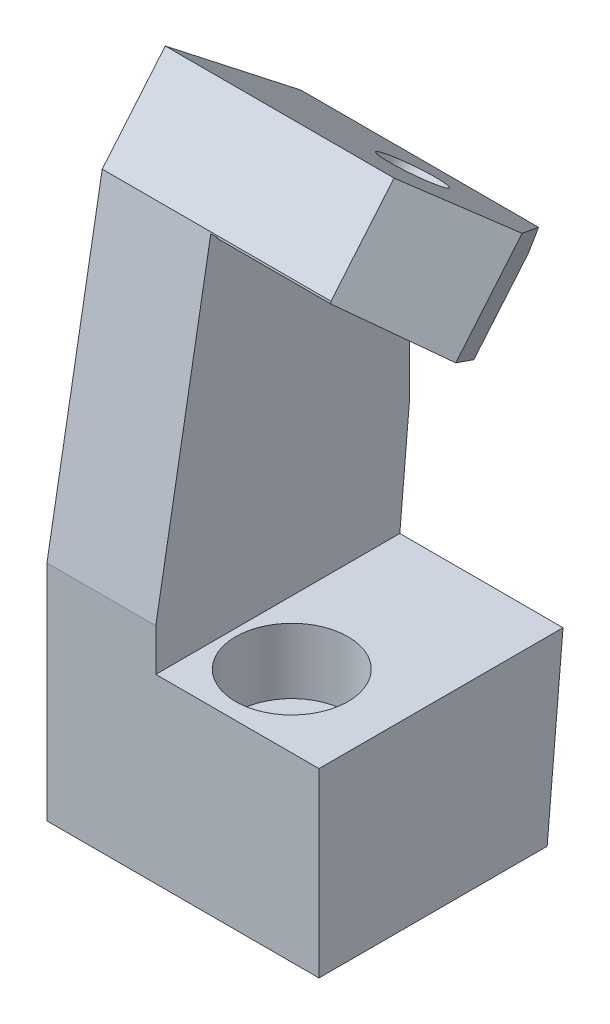
ISO-10303-21;
HEADER;
FILE_DESCRIPTION(('STEP AP214'),'2;1');
FILE_NAME('part.step','',(''),(''),'','','');
FILE_SCHEMA(('AUTOMOTIVE_DESIGN { 1 0 10303 214 1 1 1 1 }'));
ENDSEC;
DATA;
#1=APPLICATION_CONTEXT('core data for automotive mechanical design processes');
#2=APPLICATION_PROTOCOL_DEFINITION('international standard','automotive_design',2000,#1);
#3=PRODUCT_CONTEXT('',#1,'mechanical');
#4=PRODUCT('Part','Part','',(#3));
#5=PRODUCT_RELATED_PRODUCT_CATEGORY('part','',(#4));
#6=PRODUCT_DEFINITION_FORMATION('','',#4);
#7=PRODUCT_DEFINITION_CONTEXT('part definition',#1,'design');
#8=PRODUCT_DEFINITION('design','',#6,#7);
#9=PRODUCT_DEFINITION_SHAPE('','',#8);
#10=(LENGTH_UNIT() NAMED_UNIT(*) SI_UNIT(.MILLI.,.METRE.));
#11=(NAMED_UNIT(*) PLANE_ANGLE_UNIT() SI_UNIT($,.RADIAN.));
#12=(NAMED_UNIT(*) SI_UNIT($,.STERADIAN.) SOLID_ANGLE_UNIT());
#13=UNCERTAINTY_MEASURE_WITH_UNIT(LENGTH_MEASURE(1.E-05),#10,'distance_accuracy_value','');
#14=(GEOMETRIC_REPRESENTATION_CONTEXT(3) GLOBAL_UNCERTAINTY_ASSIGNED_CONTEXT((#13)) GLOBAL_UNIT_ASSIGNED_CONTEXT((#10,
#11,#12)) REPRESENTATION_CONTEXT('',''));
#15=CARTESIAN_POINT('',(0.,0.,0.));
#16=DIRECTION('',(0.,0.,1.));
#17=DIRECTION('',(1.,0.,0.));
#18=AXIS2_PLACEMENT_3D('',#15,#16,#17);
#19=CARTESIAN_POINT('',(5.5,41.9,1.));
#20=DIRECTION('',(0.,-1.,0.));
#21=DIRECTION('',(0.,0.,-1.));
#22=AXIS2_PLACEMENT_3D('',#19,#20,#21);
#23=PLANE('',#22);
#24=CARTESIAN_POINT('',(5.5,41.9,1.));
#25=DIRECTION('',(0.,-1.,0.));
#26=DIRECTION('',(0.,0.,-1.));
#27=AXIS2_PLACEMENT_3D('',#24,#25,#26);
#28=CIRCLE('',#27,1.6);
#29=CARTESIAN_POINT('',(5.5,41.9,-0.6));
#30=VERTEX_POINT('',#29);
#31=EDGE_CURVE('E232',#30,#30,#28,.T.);
#32=ORIENTED_EDGE('',*,*,#31,.T.);
#33=EDGE_LOOP('',(#32));
#34=FACE_BOUND('',#33,.T.);
#35=CARTESIAN_POINT('',(5.5,41.9,0.999999999999999));
#36=DIRECTION('',(0.,-1.,0.));
#37=DIRECTION('',(0.,0.,-1.));
#38=AXIS2_PLACEMENT_3D('',#35,#36,#37);
#39=CIRCLE('',#38,3.1);
#40=CARTESIAN_POINT('',(5.5,41.9,-2.1));
#41=VERTEX_POINT('',#40);
#42=EDGE_CURVE('E19',#41,#41,#39,.F.);
#43=ORIENTED_EDGE('',*,*,#42,.T.);
#44=EDGE_LOOP('',(#43));
#45=FACE_BOUND('',#44,.T.);
#46=ADVANCED_FACE('F16',(#34,#45),#23,.F.);
#47=CARTESIAN_POINT('',(8.6,65.,-4.8));
#48=DIRECTION('',(0.,0.76604444311876,-0.642787609686799));
#49=DIRECTION('',(0.,0.642787609686799,0.76604444311876));
#50=AXIS2_PLACEMENT_3D('',#47,#48,#49);
#51=PLANE('',#50);
#52=CARTESIAN_POINT('',(5.5,64.9977832745084,-4.8026417905683));
#53=DIRECTION('',(0.,-0.76604444311876,0.642787609686799));
#54=DIRECTION('',(0.,-0.642787609686799,-0.76604444311876));
#55=AXIS2_PLACEMENT_3D('',#52,#53,#54);
#56=CIRCLE('',#55,1.6);
#57=CARTESIAN_POINT('',(5.5,63.9693230990095,-6.02831289955832));
#58=VERTEX_POINT('',#57);
#59=EDGE_CURVE('E211',#58,#58,#56,.F.);
#60=ORIENTED_EDGE('',*,*,#59,.T.);
#61=EDGE_LOOP('',(#60));
#62=FACE_BOUND('',#61,.T.);
#63=DIRECTION('',(0.499999999999779,0.556670399226475,0.663413948169059));
#64=VECTOR('',#63,1.);
#65=CARTESIAN_POINT('',(2.40000000000056,64.9999999999998,-4.80000000000025));
#66=LINE('',#65,#64);
#67=CARTESIAN_POINT('',(2.40000000000014,64.9999999999999,-4.80000000000006));
#68=VERTEX_POINT('',#67);
#69=CARTESIAN_POINT('',(3.95,66.7256782376024,-2.74341676067633));
#70=VERTEX_POINT('',#69);
#71=EDGE_CURVE('E164',#68,#70,#66,.T.);
#72=ORIENTED_EDGE('',*,*,#71,.F.);
#73=DIRECTION('',(-0.499999999999779,0.556670399226474,0.663413948169059));
#74=VECTOR('',#73,1.);
#75=CARTESIAN_POINT('',(3.94999999999944,63.2743217623978,-6.85658323932425));
#76=LINE('',#75,#74);
#77=CARTESIAN_POINT('',(3.94999999999986,63.2743217623976,-6.85658323932373));
#78=VERTEX_POINT('',#77);
#79=EDGE_CURVE('E306',#78,#68,#76,.T.);
#80=ORIENTED_EDGE('',*,*,#79,.F.);
#81=DIRECTION('',(1.,0.,0.));
#82=VECTOR('',#81,1.);
#83=CARTESIAN_POINT('',(3.95,63.274321762398,-6.856583239324));
#84=LINE('',#83,#82);
#85=CARTESIAN_POINT('',(7.05,63.2743217623976,-6.85658323932367));
#86=VERTEX_POINT('',#85);
#87=EDGE_CURVE('E300',#86,#78,#84,.F.);
#88=ORIENTED_EDGE('',*,*,#87,.F.);
#89=DIRECTION('',(-0.499999999999779,-0.556670399226475,-0.663413948169059));
#90=VECTOR('',#89,1.);
#91=CARTESIAN_POINT('',(8.59999999999944,65.0000000000002,-4.79999999999975));
#92=LINE('',#91,#90);
#93=CARTESIAN_POINT('',(8.59999999999986,65.0000000000001,-4.79999999999994));
#94=VERTEX_POINT('',#93);
#95=EDGE_CURVE('E184',#94,#86,#92,.T.);
#96=ORIENTED_EDGE('',*,*,#95,.F.);
#97=DIRECTION('',(0.499999999999779,-0.556670399226475,-0.663413948169059));
#98=VECTOR('',#97,1.);
#99=CARTESIAN_POINT('',(7.05000000000056,66.7256782376022,-2.74341676067575));
#100=LINE('',#99,#98);
#101=CARTESIAN_POINT('',(7.05000000000014,66.7256782376025,-2.74341676067627));
#102=VERTEX_POINT('',#101);
#103=EDGE_CURVE('E179',#102,#94,#100,.T.);
#104=ORIENTED_EDGE('',*,*,#103,.F.);
#105=DIRECTION('',(1.,0.,0.));
#106=VECTOR('',#105,1.);
#107=CARTESIAN_POINT('',(7.05,66.725678237602,-2.743416760676));
#108=LINE('',#107,#106);
#109=EDGE_CURVE('E169',#70,#102,#108,.T.);
#110=ORIENTED_EDGE('',*,*,#109,.F.);
#111=EDGE_LOOP('',(#72,#80,#88,#96,#104,#110));
#112=FACE_BOUND('',#111,.T.);
#113=ADVANCED_FACE('F182',(#62,#112),#51,.F.);
#114=CARTESIAN_POINT('',(5.5,46.9,1.));
#115=DIRECTION('',(0.,-1.,0.));
#116=DIRECTION('',(0.,0.,-1.));
#117=AXIS2_PLACEMENT_3D('',#114,#115,#116);
#118=CYLINDRICAL_SURFACE('',#117,3.1);
#119=ORIENTED_EDGE('',*,*,#42,.F.);
#120=EDGE_LOOP('',(#119));
#121=FACE_BOUND('',#120,.T.);
#122=CARTESIAN_POINT('',(5.5,45.5,1.));
#123=DIRECTION('',(0.,-1.,0.));
#124=DIRECTION('',(0.,0.,-1.));
#125=AXIS2_PLACEMENT_3D('',#122,#123,#124);
#126=CIRCLE('',#125,3.1);
#127=CARTESIAN_POINT('',(5.5,45.5,-2.1));
#128=VERTEX_POINT('',#127);
#129=EDGE_CURVE('E224',#128,#128,#126,.T.);
#130=ORIENTED_EDGE('',*,*,#129,.F.);
#131=EDGE_LOOP('',(#130));
#132=FACE_BOUND('',#131,.T.);
#133=ADVANCED_FACE('F244',(#121,#132),#118,.F.);
#134=CARTESIAN_POINT('',(5.5,42.,1.));
#135=DIRECTION('',(0.,-1.,0.));
#136=DIRECTION('',(0.,0.,-1.));
#137=AXIS2_PLACEMENT_3D('',#134,#135,#136);
#138=CYLINDRICAL_SURFACE('',#137,1.6);
#139=CARTESIAN_POINT('',(5.5,35.5,0.999999999999999));
#140=DIRECTION('',(0.,-1.,0.));
#141=DIRECTION('',(0.,0.,-1.));
#142=AXIS2_PLACEMENT_3D('',#139,#140,#141);
#143=CIRCLE('',#142,1.6);
#144=CARTESIAN_POINT('',(5.5,35.5,-0.600000000000002));
#145=VERTEX_POINT('',#144);
#146=EDGE_CURVE('E218',#145,#145,#143,.T.);
#147=ORIENTED_EDGE('',*,*,#146,.T.);
#148=EDGE_LOOP('',(#147));
#149=FACE_BOUND('',#148,.T.);
#150=ORIENTED_EDGE('',*,*,#31,.F.);
#151=EDGE_LOOP('',(#150));
#152=FACE_BOUND('',#151,.T.);
#153=ADVANCED_FACE('F247',(#149,#152),#138,.F.);
#154=CARTESIAN_POINT('',(5.5,70.,-9.));
#155=DIRECTION('',(0.,-0.76604444311876,0.642787609686799));
#156=DIRECTION('',(0.,-0.642787609686799,-0.76604444311876));
#157=AXIS2_PLACEMENT_3D('',#154,#155,#156);
#158=CYLINDRICAL_SURFACE('',#157,1.6);
#159=ORIENTED_EDGE('',*,*,#59,.F.);
#160=EDGE_LOOP('',(#159));
#161=FACE_BOUND('',#160,.T.);
#162=CARTESIAN_POINT('',(5.5,66.015808099298,-5.65686604557917));
#163=DIRECTION('',(0.,-0.788010753606662,0.615661475325736));
#164=DIRECTION('',(0.,0.615661475325736,0.788010753606662));
#165=AXIS2_PLACEMENT_3D('',#162,#163,#164);
#166=ELLIPSE('',#165,1.60097527087813,1.6);
#167=CARTESIAN_POINT('',(5.5,67.0014668965269,-4.39528031586887));
#168=VERTEX_POINT('',#167);
#169=EDGE_CURVE('E212',#168,#168,#166,.F.);
#170=ORIENTED_EDGE('',*,*,#169,.T.);
#171=EDGE_LOOP('',(#170));
#172=FACE_BOUND('',#171,.T.);
#173=ADVANCED_FACE('F692',(#161,#172),#158,.F.);
#174=CARTESIAN_POINT('',(11.6,66.3,-5.8));
#175=DIRECTION('',(-0.866025403784566,-0.32139380484321,-0.38302222155925));
#176=DIRECTION('',(-0.404481746651745,0.,0.914546071352096));
#177=AXIS2_PLACEMENT_3D('',#174,#175,#176);
#178=PLANE('',#177);
#179=DIRECTION('',(-0.277350098111332,0.946172684056587,-0.166835772611237));
#180=VECTOR('',#179,1.);
#181=CARTESIAN_POINT('',(8.64822751121891,64.9900620807997,1.97321973987984));
#182=LINE('',#181,#180);
#183=CARTESIAN_POINT('',(8.64822751121796,64.9900620807997,1.97321973987963));
#184=VERTEX_POINT('',#183);
#185=CARTESIAN_POINT('',(8.61501166663479,65.1033770752301,1.95323924904375));
#186=VERTEX_POINT('',#185);
#187=EDGE_CURVE('E208',#184,#186,#182,.T.);
#188=ORIENTED_EDGE('',*,*,#187,.F.);
#189=DIRECTION('',(0.499999999999988,-0.556670399226648,-0.663413948168756));
#190=VECTOR('',#189,1.);
#191=CARTESIAN_POINT('',(8.648227511217,64.9900620808002,1.97321973987798));
#192=LINE('',#191,#190);
#193=CARTESIAN_POINT('',(11.5999999999999,61.7037333412863,-1.94327434188064));
#194=VERTEX_POINT('',#193);
#195=EDGE_CURVE('E345',#184,#194,#192,.T.);
#196=ORIENTED_EDGE('',*,*,#195,.T.);
#197=DIRECTION('',(1.0827264915471E-13,0.76604444311896,-0.642787609686561));
#198=VECTOR('',#197,1.);
#199=CARTESIAN_POINT('',(11.5999999999981,61.7037333412867,-1.94327434188016));
#200=LINE('',#199,#198);
#201=CARTESIAN_POINT('',(11.5999999999994,66.0607960692296,-5.59928406991396));
#202=VERTEX_POINT('',#201);
#203=EDGE_CURVE('E189',#194,#202,#200,.T.);
#204=ORIENTED_EDGE('',*,*,#203,.T.);
#205=DIRECTION('',(-0.499771507944661,0.533259671054525,0.682541253752137));
#206=VECTOR('',#205,1.);
#207=CARTESIAN_POINT('',(11.6,66.0607960692303,-5.59928406991501));
#208=LINE('',#207,#206);
#209=CARTESIAN_POINT('',(8.61501166663423,69.2457993586304,-1.52266576113909));
#210=VERTEX_POINT('',#209);
#211=EDGE_CURVE('E217',#202,#210,#208,.T.);
#212=ORIENTED_EDGE('',*,*,#211,.T.);
#213=DIRECTION('',(0.,0.76604444311876,-0.642787609686799));
#214=VECTOR('',#213,1.);
#215=CARTESIAN_POINT('',(8.615011666634,76.358185854702,-7.490666646785));
#216=LINE('',#215,#214);
#217=EDGE_CURVE('E348',#210,#186,#216,.F.);
#218=ORIENTED_EDGE('',*,*,#217,.T.);
#219=EDGE_LOOP('',(#188,#196,#204,#212,#218));
#220=FACE_BOUND('',#219,.T.);
#221=ADVANCED_FACE('F682',(#220),#178,.F.);
#222=CARTESIAN_POINT('',(8.55,62.904310564719,-9.846825083831));
#223=DIRECTION('',(-0.866025403784566,0.32139380484321,0.38302222155925));
#224=DIRECTION('',(0.404481746651745,0.,0.914546071352096));
#225=AXIS2_PLACEMENT_3D('',#222,#223,#224);
#226=PLANE('',#225);
#227=ORIENTED_EDGE('',*,*,#203,.F.);
#228=DIRECTION('',(-0.500000000000036,-0.556670399226631,-0.663413948168734));
#229=VECTOR('',#228,1.);
#230=CARTESIAN_POINT('',(11.6,61.703733341286,-1.943274341881));
#231=LINE('',#230,#229);
#232=CARTESIAN_POINT('',(8.54999999999983,58.308043906005,-5.99009942571038));
#233=VERTEX_POINT('',#232);
#234=EDGE_CURVE('E341',#194,#233,#231,.T.);
#235=ORIENTED_EDGE('',*,*,#234,.T.);
#236=DIRECTION('',(0.,-0.76604444311876,0.642787609686799));
#237=VECTOR('',#236,1.);
#238=CARTESIAN_POINT('',(8.55,62.904310564719,-9.846825083831));
#239=LINE('',#238,#237);
#240=CARTESIAN_POINT('',(8.55000000000001,61.895103728765,-8.99999999999998));
#241=VERTEX_POINT('',#240);
#242=EDGE_CURVE('E360',#233,#241,#239,.F.);
#243=ORIENTED_EDGE('',*,*,#242,.T.);
#244=DIRECTION('',(-0.34792702276705,-0.937521619392564,-1.39053062840272E-13));
#245=VECTOR('',#244,1.);
#246=CARTESIAN_POINT('',(9.1099220462825,63.4038655932202,-8.99999999999978));
#247=LINE('',#246,#245);
#248=CARTESIAN_POINT('',(9.10992204628275,63.4038655932204,-9.00000000000013));
#249=VERTEX_POINT('',#248);
#250=EDGE_CURVE('E205',#249,#241,#247,.T.);
#251=ORIENTED_EDGE('',*,*,#250,.F.);
#252=DIRECTION('',(0.499771507944679,0.533259671054519,0.682541253752128));
#253=VECTOR('',#252,1.);
#254=CARTESIAN_POINT('',(9.10992204628301,63.4038655932212,-9.00000000000095));
#255=LINE('',#254,#253);
#256=EDGE_CURVE('E356',#249,#202,#255,.T.);
#257=ORIENTED_EDGE('',*,*,#256,.T.);
#258=EDGE_LOOP('',(#227,#235,#243,#251,#257));
#259=FACE_BOUND('',#258,.T.);
#260=ADVANCED_FACE('F673',(#259),#226,.F.);
#261=CARTESIAN_POINT('',(8.6,65.,-4.8));
#262=DIRECTION('',(-0.866025403784566,-0.32139380484321,-0.38302222155925));
#263=DIRECTION('',(-0.404481746651745,0.,0.914546071352096));
#264=AXIS2_PLACEMENT_3D('',#261,#262,#263);
#265=PLANE('',#264);
#266=DIRECTION('',(-0.500000000000015,0.556670399226639,0.663413948168743));
#267=VECTOR('',#266,1.);
#268=CARTESIAN_POINT('',(8.6,61.659008533276,-1.99657529250498));
#269=LINE('',#268,#267);
#270=CARTESIAN_POINT('',(8.59999999999992,61.6590085332761,-1.99657529250485));
#271=VERTEX_POINT('',#270);
#272=CARTESIAN_POINT('',(7.0500000000005,63.3846867708786,0.0600079468188868));
#273=VERTEX_POINT('',#272);
#274=EDGE_CURVE('E193',#271,#273,#269,.T.);
#275=ORIENTED_EDGE('',*,*,#274,.T.);
#276=DIRECTION('',(0.,0.76604444311876,-0.642787609686799));
#277=VECTOR('',#276,1.);
#278=CARTESIAN_POINT('',(7.05,66.725678237602,-2.743416760676));
#279=LINE('',#278,#277);
#280=EDGE_CURVE('E174',#102,#273,#279,.F.);
#281=ORIENTED_EDGE('',*,*,#280,.F.);
#282=ORIENTED_EDGE('',*,*,#103,.T.);
#283=DIRECTION('',(0.,0.766044443118905,-0.642787609686626));
#284=VECTOR('',#283,1.);
#285=CARTESIAN_POINT('',(8.59999999999918,61.6590085332763,-1.99657529250464));
#286=LINE('',#285,#284);
#287=EDGE_CURVE('E290',#271,#94,#286,.T.);
#288=ORIENTED_EDGE('',*,*,#287,.F.);
#289=EDGE_LOOP('',(#275,#281,#282,#288));
#290=FACE_BOUND('',#289,.T.);
#291=ADVANCED_FACE('F192',(#290),#265,.T.);
#292=CARTESIAN_POINT('',(7.05,66.725678237602,-2.743416760676));
#293=DIRECTION('',(0.,-0.642787609686799,-0.76604444311876));
#294=DIRECTION('',(0.,0.76604444311876,-0.642787609686799));
#295=AXIS2_PLACEMENT_3D('',#292,#293,#294);
#296=PLANE('',#295);
#297=DIRECTION('',(1.,0.,0.));
#298=VECTOR('',#297,1.);
#299=CARTESIAN_POINT('',(11.6,63.3846867708785,0.0600079468180551));
#300=LINE('',#299,#298);
#301=CARTESIAN_POINT('',(3.94999999999989,63.3846867708787,0.0600079468190101));
#302=VERTEX_POINT('',#301);
#303=EDGE_CURVE('E320',#273,#302,#300,.F.);
#304=ORIENTED_EDGE('',*,*,#303,.T.);
#305=DIRECTION('',(0.,-0.766044443118949,0.642787609686574));
#306=VECTOR('',#305,1.);
#307=CARTESIAN_POINT('',(3.95,66.725678237602,-2.743416760676));
#308=LINE('',#307,#306);
#309=EDGE_CURVE('E176',#70,#302,#308,.T.);
#310=ORIENTED_EDGE('',*,*,#309,.F.);
#311=ORIENTED_EDGE('',*,*,#109,.T.);
#312=ORIENTED_EDGE('',*,*,#280,.T.);
#313=EDGE_LOOP('',(#304,#310,#311,#312));
#314=FACE_BOUND('',#313,.T.);
#315=ADVANCED_FACE('F172',(#314),#296,.T.);
#316=CARTESIAN_POINT('',(3.95,66.725678237602,-2.743416760676));
#317=DIRECTION('',(0.866025403784566,-0.32139380484321,-0.38302222155925));
#318=DIRECTION('',(-0.404481746651745,0.,-0.914546071352096));
#319=AXIS2_PLACEMENT_3D('',#316,#317,#318);
#320=PLANE('',#319);
#321=DIRECTION('',(-0.500000000000015,-0.556670399226639,-0.663413948168742));
#322=VECTOR('',#321,1.);
#323=CARTESIAN_POINT('',(3.95,63.3846867708785,0.0600079468180551));
#324=LINE('',#323,#322);
#325=CARTESIAN_POINT('',(2.40000000000022,61.659008533276,-1.99657529250504));
#326=VERTEX_POINT('',#325);
#327=EDGE_CURVE('E314',#302,#326,#324,.T.);
#328=ORIENTED_EDGE('',*,*,#327,.T.);
#329=DIRECTION('',(0.,-0.766044443118905,0.642787609686626));
#330=VECTOR('',#329,1.);
#331=CARTESIAN_POINT('',(2.4,65.,-4.8));
#332=LINE('',#331,#330);
#333=EDGE_CURVE('E303',#68,#326,#332,.T.);
#334=ORIENTED_EDGE('',*,*,#333,.F.);
#335=ORIENTED_EDGE('',*,*,#71,.T.);
#336=ORIENTED_EDGE('',*,*,#309,.T.);
#337=EDGE_LOOP('',(#328,#334,#335,#336));
#338=FACE_BOUND('',#337,.T.);
#339=ADVANCED_FACE('F313',(#338),#320,.T.);
#340=CARTESIAN_POINT('',(2.4,65.,-4.8));
#341=DIRECTION('',(0.866025403784566,0.32139380484321,0.38302222155925));
#342=DIRECTION('',(0.404481746651745,0.,-0.914546071352096));
#343=AXIS2_PLACEMENT_3D('',#340,#341,#342);
#344=PLANE('',#343);
#345=DIRECTION('',(0.49999999999996,-0.556670399226658,-0.663413948168768));
#346=VECTOR('',#345,1.);
#347=CARTESIAN_POINT('',(2.4,61.659008533276,-1.99657529250498));
#348=LINE('',#347,#346);
#349=CARTESIAN_POINT('',(3.94999999999985,59.9333302956739,-4.05315853182868));
#350=VERTEX_POINT('',#349);
#351=EDGE_CURVE('E322',#326,#350,#348,.T.);
#352=ORIENTED_EDGE('',*,*,#351,.T.);
#353=DIRECTION('',(0.,-0.76604444311876,0.642787609686799));
#354=VECTOR('',#353,1.);
#355=CARTESIAN_POINT('',(3.95,63.274321762398,-6.856583239324));
#356=LINE('',#355,#354);
#357=EDGE_CURVE('E297',#78,#350,#356,.T.);
#358=ORIENTED_EDGE('',*,*,#357,.F.);
#359=ORIENTED_EDGE('',*,*,#79,.T.);
#360=ORIENTED_EDGE('',*,*,#333,.T.);
#361=EDGE_LOOP('',(#352,#358,#359,#360));
#362=FACE_BOUND('',#361,.T.);
#363=ADVANCED_FACE('F445',(#362),#344,.T.);
#364=CARTESIAN_POINT('',(3.95,63.274321762398,-6.856583239324));
#365=DIRECTION('',(0.,0.642787609686799,0.76604444311876));
#366=DIRECTION('',(0.,-0.76604444311876,0.642787609686799));
#367=AXIS2_PLACEMENT_3D('',#364,#365,#366);
#368=PLANE('',#367);
#369=DIRECTION('',(1.,0.,0.));
#370=VECTOR('',#369,1.);
#371=CARTESIAN_POINT('',(11.6,59.9333302956732,-4.05315853182833));
#372=LINE('',#371,#370);
#373=CARTESIAN_POINT('',(7.04999999999993,59.9333302956742,-4.05315853182837));
#374=VERTEX_POINT('',#373);
#375=EDGE_CURVE('E439',#350,#374,#372,.T.);
#376=ORIENTED_EDGE('',*,*,#375,.T.);
#377=DIRECTION('',(0.,-0.766044443118905,0.642787609686626));
#378=VECTOR('',#377,1.);
#379=CARTESIAN_POINT('',(7.05,63.274321762398,-6.856583239324));
#380=LINE('',#379,#378);
#381=EDGE_CURVE('E292',#86,#374,#380,.T.);
#382=ORIENTED_EDGE('',*,*,#381,.F.);
#383=ORIENTED_EDGE('',*,*,#87,.T.);
#384=ORIENTED_EDGE('',*,*,#357,.T.);
#385=EDGE_LOOP('',(#376,#382,#383,#384));
#386=FACE_BOUND('',#385,.T.);
#387=ADVANCED_FACE('F449',(#386),#368,.T.);
#388=CARTESIAN_POINT('',(7.05,63.274321762398,-6.856583239324));
#389=DIRECTION('',(-0.866025403784566,0.32139380484321,0.38302222155925));
#390=DIRECTION('',(0.404481746651745,0.,0.914546071352096));
#391=AXIS2_PLACEMENT_3D('',#388,#389,#390);
#392=PLANE('',#391);
#393=DIRECTION('',(0.49999999999996,0.556670399226659,0.663413948168768));
#394=VECTOR('',#393,1.);
#395=CARTESIAN_POINT('',(7.05,59.9333302956732,-4.05315853182833));
#396=LINE('',#395,#394);
#397=EDGE_CURVE('E435',#374,#271,#396,.T.);
#398=ORIENTED_EDGE('',*,*,#397,.T.);
#399=ORIENTED_EDGE('',*,*,#287,.T.);
#400=ORIENTED_EDGE('',*,*,#95,.T.);
#401=ORIENTED_EDGE('',*,*,#381,.T.);
#402=EDGE_LOOP('',(#398,#399,#400,#401));
#403=FACE_BOUND('',#402,.T.);
#404=ADVANCED_FACE('F452',(#403),#392,.T.);
#405=CARTESIAN_POINT('',(-0.6,66.3,-5.8));
#406=DIRECTION('',(0.866025403784566,0.32139380484321,0.38302222155925));
#407=DIRECTION('',(0.404481746651745,0.,-0.914546071352096));
#408=AXIS2_PLACEMENT_3D('',#405,#406,#407);
#409=PLANE('',#408);
#410=DIRECTION('',(-0.499999999999947,0.556670399226664,0.663413948168773));
#411=VECTOR('',#410,1.);
#412=CARTESIAN_POINT('',(2.45,58.3080439060038,-5.99009942570999));
#413=LINE('',#412,#411);
#414=CARTESIAN_POINT('',(2.44999999999978,58.3080439060051,-5.99009942571026));
#415=VERTEX_POINT('',#414);
#416=CARTESIAN_POINT('',(1.99999999999963,58.8090472653086,-5.39302687235892));
#417=VERTEX_POINT('',#416);
#418=EDGE_CURVE('E330',#415,#417,#413,.T.);
#419=ORIENTED_EDGE('',*,*,#418,.T.);
#420=DIRECTION('',(0.,-0.76604444311891,0.642787609686621));
#421=VECTOR('',#420,1.);
#422=CARTESIAN_POINT('',(2.,63.107670448565,-9.));
#423=LINE('',#422,#421);
#424=CARTESIAN_POINT('',(1.9999999999995,63.1076704485648,-9.00000000000022));
#425=VERTEX_POINT('',#424);
#426=EDGE_CURVE('E382',#425,#417,#423,.T.);
#427=ORIENTED_EDGE('',*,*,#426,.F.);
#428=DIRECTION('',(-0.347927022767029,0.937521619392572,0.));
#429=VECTOR('',#428,1.);
#430=CARTESIAN_POINT('',(2.44999999999875,61.8951037287645,-9.00000000000055));
#431=LINE('',#430,#429);
#432=CARTESIAN_POINT('',(2.44999999999938,61.8951037287648,-9.00000000000025));
#433=VERTEX_POINT('',#432);
#434=EDGE_CURVE('E267',#433,#425,#431,.T.);
#435=ORIENTED_EDGE('',*,*,#434,.F.);
#436=DIRECTION('',(0.,-0.76604444311876,0.642787609686799));
#437=VECTOR('',#436,1.);
#438=CARTESIAN_POINT('',(2.45,62.904310564719,-9.846825083831));
#439=LINE('',#438,#437);
#440=EDGE_CURVE('E363',#433,#415,#439,.T.);
#441=ORIENTED_EDGE('',*,*,#440,.T.);
#442=EDGE_LOOP('',(#419,#427,#435,#441));
#443=FACE_BOUND('',#442,.T.);
#444=ADVANCED_FACE('F255',(#443),#409,.F.);
#445=CARTESIAN_POINT('',(-4.,45.5,-25.));
#446=DIRECTION('',(0.,1.,0.));
#447=DIRECTION('',(0.,0.,1.));
#448=AXIS2_PLACEMENT_3D('',#445,#446,#447);
#449=PLANE('',#448);
#450=ORIENTED_EDGE('',*,*,#129,.T.);
#451=EDGE_LOOP('',(#450));
#452=FACE_BOUND('',#451,.T.);
#453=DIRECTION('',(1.,0.,0.));
#454=VECTOR('',#453,1.);
#455=CARTESIAN_POINT('',(-4.,45.5,5.));
#456=LINE('',#455,#454);
#457=CARTESIAN_POINT('',(2.,45.5,5.));
#458=VERTEX_POINT('',#457);
#459=CARTESIAN_POINT('',(11.,45.5,5.));
#460=VERTEX_POINT('',#459);
#461=EDGE_CURVE('E229',#458,#460,#456,.T.);
#462=ORIENTED_EDGE('',*,*,#461,.T.);
#463=DIRECTION('',(0.,0.,-1.));
#464=VECTOR('',#463,1.);
#465=CARTESIAN_POINT('',(11.,45.5,-25.));
#466=LINE('',#465,#464);
#467=CARTESIAN_POINT('',(11.,45.5,-8.45670912720023));
#468=VERTEX_POINT('',#467);
#469=EDGE_CURVE('E228',#468,#460,#466,.F.);
#470=ORIENTED_EDGE('',*,*,#469,.F.);
#471=DIRECTION('',(1.,0.,0.));
#472=VECTOR('',#471,1.);
#473=CARTESIAN_POINT('',(-25.,45.4999999999999,-8.4567091272009));
#474=LINE('',#473,#472);
#475=CARTESIAN_POINT('',(2.,45.5,-8.45670912720023));
#476=VERTEX_POINT('',#475);
#477=EDGE_CURVE('E387',#476,#468,#474,.T.);
#478=ORIENTED_EDGE('',*,*,#477,.F.);
#479=DIRECTION('',(0.,0.,-1.));
#480=VECTOR('',#479,1.);
#481=CARTESIAN_POINT('',(2.,45.5,-25.));
#482=LINE('',#481,#480);
#483=EDGE_CURVE('E262',#458,#476,#482,.T.);
#484=ORIENTED_EDGE('',*,*,#483,.F.);
#485=EDGE_LOOP('',(#462,#470,#478,#484));
#486=FACE_BOUND('',#485,.T.);
#487=ADVANCED_FACE('F251',(#452,#486),#449,.T.);
#488=CARTESIAN_POINT('',(11.,35.5,-25.));
#489=DIRECTION('',(1.,0.,0.));
#490=DIRECTION('',(0.,0.,-1.));
#491=AXIS2_PLACEMENT_3D('',#488,#489,#490);
#492=PLANE('',#491);
#493=ORIENTED_EDGE('',*,*,#469,.T.);
#494=DIRECTION('',(0.,1.,0.));
#495=VECTOR('',#494,1.);
#496=CARTESIAN_POINT('',(11.,35.5,5.));
#497=LINE('',#496,#495);
#498=CARTESIAN_POINT('',(11.,35.5,5.));
#499=VERTEX_POINT('',#498);
#500=EDGE_CURVE('E272',#460,#499,#497,.F.);
#501=ORIENTED_EDGE('',*,*,#500,.T.);
#502=DIRECTION('',(0.,0.,1.));
#503=VECTOR('',#502,1.);
#504=CARTESIAN_POINT('',(11.,35.5,-25.));
#505=LINE('',#504,#503);
#506=CARTESIAN_POINT('',(11.,35.5,-7.58182249194122));
#507=VERTEX_POINT('',#506);
#508=EDGE_CURVE('E223',#499,#507,#505,.F.);
#509=ORIENTED_EDGE('',*,*,#508,.T.);
#510=DIRECTION('',(0.,0.996194698091747,-0.0871557427476379));
#511=VECTOR('',#510,1.);
#512=CARTESIAN_POINT('',(11.,86.,-12.));
#513=LINE('',#512,#511);
#514=EDGE_CURVE('E275',#468,#507,#513,.F.);
#515=ORIENTED_EDGE('',*,*,#514,.F.);
#516=EDGE_LOOP('',(#493,#501,#509,#515));
#517=FACE_BOUND('',#516,.T.);
#518=ADVANCED_FACE('F254',(#517),#492,.T.);
#519=CARTESIAN_POINT('',(-4.,35.5,-25.));
#520=DIRECTION('',(0.,1.,0.));
#521=DIRECTION('',(0.,0.,1.));
#522=AXIS2_PLACEMENT_3D('',#519,#520,#521);
#523=PLANE('',#522);
#524=DIRECTION('',(1.,0.,0.));
#525=VECTOR('',#524,1.);
#526=CARTESIAN_POINT('',(-4.,35.5,5.));
#527=LINE('',#526,#525);
#528=CARTESIAN_POINT('',(-4.,35.5,5.));
#529=VERTEX_POINT('',#528);
#530=EDGE_CURVE('E222',#529,#499,#527,.T.);
#531=ORIENTED_EDGE('',*,*,#530,.F.);
#532=DIRECTION('',(0.,0.,-1.));
#533=VECTOR('',#532,1.);
#534=CARTESIAN_POINT('',(-4.,35.5,-25.));
#535=LINE('',#534,#533);
#536=CARTESIAN_POINT('',(-4.,35.5,-7.58182249194122));
#537=VERTEX_POINT('',#536);
#538=EDGE_CURVE('E412',#529,#537,#535,.T.);
#539=ORIENTED_EDGE('',*,*,#538,.T.);
#540=DIRECTION('',(1.,0.,0.));
#541=VECTOR('',#540,1.);
#542=CARTESIAN_POINT('',(-25.,35.4999999999999,-7.58182249194187));
#543=LINE('',#542,#541);
#544=EDGE_CURVE('E386',#507,#537,#543,.F.);
#545=ORIENTED_EDGE('',*,*,#544,.F.);
#546=ORIENTED_EDGE('',*,*,#508,.F.);
#547=EDGE_LOOP('',(#531,#539,#545,#546));
#548=FACE_BOUND('',#547,.T.);
#549=ORIENTED_EDGE('',*,*,#146,.F.);
#550=EDGE_LOOP('',(#549));
#551=FACE_BOUND('',#550,.T.);
#552=ADVANCED_FACE('F507',(#548,#551),#523,.F.);
#553=CARTESIAN_POINT('',(2.45,62.904310564719,-9.846825083831));
#554=DIRECTION('',(0.,0.642787609686799,0.76604444311876));
#555=DIRECTION('',(0.,-0.76604444311876,0.642787609686799));
#556=AXIS2_PLACEMENT_3D('',#553,#554,#555);
#557=PLANE('',#556);
#558=DIRECTION('',(1.,0.,0.));
#559=VECTOR('',#558,1.);
#560=CARTESIAN_POINT('',(11.6,58.3080439060038,-5.99009942570999));
#561=LINE('',#560,#559);
#562=EDGE_CURVE('E337',#233,#415,#561,.F.);
#563=ORIENTED_EDGE('',*,*,#562,.T.);
#564=ORIENTED_EDGE('',*,*,#440,.F.);
#565=DIRECTION('',(1.,0.,0.));
#566=VECTOR('',#565,1.);
#567=CARTESIAN_POINT('',(-5.,61.895103728765,-9.));
#568=LINE('',#567,#566);
#569=EDGE_CURVE('E368',#433,#241,#568,.T.);
#570=ORIENTED_EDGE('',*,*,#569,.T.);
#571=ORIENTED_EDGE('',*,*,#242,.F.);
#572=EDGE_LOOP('',(#563,#564,#570,#571));
#573=FACE_BOUND('',#572,.T.);
#574=ADVANCED_FACE('F503',(#573),#557,.F.);
#575=CARTESIAN_POINT('',(-25.,34.679838695899,-45.76507787011));
#576=DIRECTION('',(0.,-0.788010753606662,0.615661475325736));
#577=DIRECTION('',(0.,-0.615661475325736,-0.788010753606662));
#578=AXIS2_PLACEMENT_3D('',#575,#576,#577);
#579=PLANE('',#578);
#580=ORIENTED_EDGE('',*,*,#169,.F.);
#581=EDGE_LOOP('',(#580));
#582=FACE_BOUND('',#581,.T.);
#583=ORIENTED_EDGE('',*,*,#256,.F.);
#584=DIRECTION('',(1.,0.,0.));
#585=VECTOR('',#584,1.);
#586=CARTESIAN_POINT('',(-5.,63.40386559322,-9.));
#587=LINE('',#586,#585);
#588=CARTESIAN_POINT('',(-3.99999999999999,63.4038655932206,-9.00000000000047));
#589=VERTEX_POINT('',#588);
#590=EDGE_CURVE('E396',#249,#589,#587,.F.);
#591=ORIENTED_EDGE('',*,*,#590,.T.);
#592=DIRECTION('',(0.,0.615661475325623,0.78801075360675));
#593=VECTOR('',#592,1.);
#594=CARTESIAN_POINT('',(-4.,63.749306274256,-8.55785609089));
#595=LINE('',#594,#593);
#596=CARTESIAN_POINT('',(-4.,69.2457993586303,-1.5226657611392));
#597=VERTEX_POINT('',#596);
#598=EDGE_CURVE('E35',#589,#597,#595,.T.);
#599=ORIENTED_EDGE('',*,*,#598,.T.);
#600=DIRECTION('',(1.,0.,0.));
#601=VECTOR('',#600,1.);
#602=CARTESIAN_POINT('',(-25.,69.2457993586306,-1.52266576113711));
#603=LINE('',#602,#601);
#604=EDGE_CURVE('E216',#597,#210,#603,.T.);
#605=ORIENTED_EDGE('',*,*,#604,.T.);
#606=ORIENTED_EDGE('',*,*,#211,.F.);
#607=EDGE_LOOP('',(#583,#591,#599,#605,#606));
#608=FACE_BOUND('',#607,.T.);
#609=ADVANCED_FACE('F499',(#582,#608),#579,.F.);
#610=CARTESIAN_POINT('',(-25.,76.358185854702,-7.490666646785));
#611=DIRECTION('',(0.,-0.642787609686799,-0.76604444311876));
#612=DIRECTION('',(0.,0.76604444311876,-0.642787609686799));
#613=AXIS2_PLACEMENT_3D('',#610,#611,#612);
#614=PLANE('',#613);
#615=ORIENTED_EDGE('',*,*,#217,.F.);
#616=ORIENTED_EDGE('',*,*,#604,.F.);
#617=DIRECTION('',(0.,-0.766044443119022,0.642787609686488));
#618=VECTOR('',#617,1.);
#619=CARTESIAN_POINT('',(-4.,69.245799358629,-1.522665761139));
#620=LINE('',#619,#618);
#621=CARTESIAN_POINT('',(-4.,65.1033770752298,1.9532392490434));
#622=VERTEX_POINT('',#621);
#623=EDGE_CURVE('E377',#597,#622,#620,.T.);
#624=ORIENTED_EDGE('',*,*,#623,.T.);
#625=DIRECTION('',(1.,0.,0.));
#626=VECTOR('',#625,1.);
#627=CARTESIAN_POINT('',(-25.,65.1033770752294,1.95323924904401));
#628=LINE('',#627,#626);
#629=EDGE_CURVE('E379',#622,#186,#628,.T.);
#630=ORIENTED_EDGE('',*,*,#629,.T.);
#631=EDGE_LOOP('',(#615,#616,#624,#630));
#632=FACE_BOUND('',#631,.T.);
#633=ADVANCED_FACE('F496',(#632),#614,.F.);
#634=CARTESIAN_POINT('',(11.6,61.703733341286,-1.943274341881));
#635=DIRECTION('',(0.,0.76604444311876,-0.642787609686799));
#636=DIRECTION('',(0.,0.642787609686799,0.76604444311876));
#637=AXIS2_PLACEMENT_3D('',#634,#635,#636);
#638=PLANE('',#637);
#639=ORIENTED_EDGE('',*,*,#375,.F.);
#640=ORIENTED_EDGE('',*,*,#351,.F.);
#641=ORIENTED_EDGE('',*,*,#327,.F.);
#642=ORIENTED_EDGE('',*,*,#303,.F.);
#643=ORIENTED_EDGE('',*,*,#274,.F.);
#644=ORIENTED_EDGE('',*,*,#397,.F.);
#645=EDGE_LOOP('',(#639,#640,#641,#642,#643,#644));
#646=FACE_BOUND('',#645,.T.);
#647=DIRECTION('',(-0.499999999999779,-0.556670399226511,-0.663413948169028));
#648=VECTOR('',#647,1.);
#649=CARTESIAN_POINT('',(2.35177248878233,64.9900620807993,1.9732197398793));
#650=LINE('',#649,#648);
#651=CARTESIAN_POINT('',(2.35177248878284,64.9900620807998,1.97321973987903));
#652=VERTEX_POINT('',#651);
#653=CARTESIAN_POINT('',(1.99999999999994,64.5984194172646,1.50647818859758));
#654=VERTEX_POINT('',#653);
#655=EDGE_CURVE('E432',#652,#654,#650,.T.);
#656=ORIENTED_EDGE('',*,*,#655,.T.);
#657=DIRECTION('',(0.,0.642787609686553,0.766044443118967));
#658=VECTOR('',#657,1.);
#659=CARTESIAN_POINT('',(2.,58.809047265309,-5.393026872359));
#660=LINE('',#659,#658);
#661=EDGE_CURVE('E383',#417,#654,#660,.T.);
#662=ORIENTED_EDGE('',*,*,#661,.F.);
#663=ORIENTED_EDGE('',*,*,#418,.F.);
#664=ORIENTED_EDGE('',*,*,#562,.F.);
#665=ORIENTED_EDGE('',*,*,#234,.F.);
#666=ORIENTED_EDGE('',*,*,#195,.F.);
#667=DIRECTION('',(1.,0.,0.));
#668=VECTOR('',#667,1.);
#669=CARTESIAN_POINT('',(-25.,64.9900620807993,1.97321973988087));
#670=LINE('',#669,#668);
#671=EDGE_CURVE('E375',#184,#652,#670,.F.);
#672=ORIENTED_EDGE('',*,*,#671,.T.);
#673=EDGE_LOOP('',(#656,#662,#663,#664,#665,#666,#672));
#674=FACE_BOUND('',#673,.T.);
#675=ADVANCED_FACE('F318',(#646,#674),#638,.F.);
#676=CARTESIAN_POINT('',(2.45,69.695689435281,-1.753174916169));
#677=DIRECTION('',(0.866025403784566,-0.32139380484321,-0.38302222155925));
#678=DIRECTION('',(-0.404481746651745,0.,-0.914546071352096));
#679=AXIS2_PLACEMENT_3D('',#676,#677,#678);
#680=PLANE('',#679);
#681=DIRECTION('',(0.277350098107286,0.946172684058194,-0.166835772608851));
#682=VECTOR('',#681,1.);
#683=CARTESIAN_POINT('',(2.35177248878301,64.9900620807993,1.97321973988087));
#684=LINE('',#683,#682);
#685=CARTESIAN_POINT('',(2.36259614615572,65.0269867078964,1.96670893186949));
#686=VERTEX_POINT('',#685);
#687=EDGE_CURVE('E371',#652,#686,#684,.T.);
#688=ORIENTED_EDGE('',*,*,#687,.T.);
#689=DIRECTION('',(0.49994288242154,0.545028197192067,0.673053770943754));
#690=VECTOR('',#689,1.);
#691=CARTESIAN_POINT('',(2.,64.6316913035678,1.47855976107134));
#692=LINE('',#691,#690);
#693=CARTESIAN_POINT('',(1.99999999999979,64.6316913035673,1.47855976107193));
#694=VERTEX_POINT('',#693);
#695=EDGE_CURVE('E429',#694,#686,#692,.T.);
#696=ORIENTED_EDGE('',*,*,#695,.F.);
#697=DIRECTION('',(0.,0.766044443112322,-0.642787609694472));
#698=VECTOR('',#697,1.);
#699=CARTESIAN_POINT('',(2.,64.598419417264,1.506478188598));
#700=LINE('',#699,#698);
#701=EDGE_CURVE('E422',#654,#694,#700,.T.);
#702=ORIENTED_EDGE('',*,*,#701,.F.);
#703=ORIENTED_EDGE('',*,*,#655,.F.);
#704=EDGE_LOOP('',(#688,#696,#702,#703));
#705=FACE_BOUND('',#704,.T.);
#706=ADVANCED_FACE('F489',(#705),#680,.F.);
#707=CARTESIAN_POINT('',(-4.,59.373679827828,-5.014543659347));
#708=DIRECTION('',(0.,-0.777145961456903,0.629320391049922));
#709=DIRECTION('',(0.,-0.629320391049922,-0.777145961456903));
#710=AXIS2_PLACEMENT_3D('',#707,#708,#709);
#711=PLANE('',#710);
#712=DIRECTION('',(0.,0.629320391050042,0.777145961456805));
#713=VECTOR('',#712,1.);
#714=CARTESIAN_POINT('',(2.,64.631691303567,1.478559761072));
#715=LINE('',#714,#713);
#716=CARTESIAN_POINT('',(2.,65.0269867078965,1.96670893186921));
#717=VERTEX_POINT('',#716);
#718=EDGE_CURVE('E419',#694,#717,#715,.T.);
#719=ORIENTED_EDGE('',*,*,#718,.F.);
#720=ORIENTED_EDGE('',*,*,#695,.T.);
#721=DIRECTION('',(1.,0.,0.));
#722=VECTOR('',#721,1.);
#723=CARTESIAN_POINT('',(-25.,65.0269867078964,1.96670893187106));
#724=LINE('',#723,#722);
#725=EDGE_CURVE('E374',#686,#717,#724,.F.);
#726=ORIENTED_EDGE('',*,*,#725,.T.);
#727=EDGE_LOOP('',(#719,#720,#726));
#728=FACE_BOUND('',#727,.T.);
#729=ADVANCED_FACE('F486',(#728),#711,.T.);
#730=CARTESIAN_POINT('',(2.,35.5,-25.));
#731=DIRECTION('',(1.,0.,0.));
#732=DIRECTION('',(0.,0.,-1.));
#733=AXIS2_PLACEMENT_3D('',#730,#731,#732);
#734=PLANE('',#733);
#735=ORIENTED_EDGE('',*,*,#718,.T.);
#736=DIRECTION('',(0.,0.98480775301219,-0.173648177667033));
#737=VECTOR('',#736,1.);
#738=CARTESIAN_POINT('',(2.00000000000002,83.395277334996,-1.272116295183));
#739=LINE('',#738,#737);
#740=CARTESIAN_POINT('',(2.00000000000001,47.8243382195962,5.00000000000095));
#741=VERTEX_POINT('',#740);
#742=EDGE_CURVE('E769',#717,#741,#739,.F.);
#743=ORIENTED_EDGE('',*,*,#742,.T.);
#744=DIRECTION('',(0.,1.,0.));
#745=VECTOR('',#744,1.);
#746=CARTESIAN_POINT('',(2.,35.5,5.));
#747=LINE('',#746,#745);
#748=EDGE_CURVE('E416',#458,#741,#747,.T.);
#749=ORIENTED_EDGE('',*,*,#748,.F.);
#750=ORIENTED_EDGE('',*,*,#483,.T.);
#751=DIRECTION('',(0.,0.996194698091747,-0.0871557427476379));
#752=VECTOR('',#751,1.);
#753=CARTESIAN_POINT('',(2.,86.,-12.));
#754=LINE('',#753,#752);
#755=CARTESIAN_POINT('',(2.,51.709843091716,-9.00000000000035));
#756=VERTEX_POINT('',#755);
#757=EDGE_CURVE('E408',#756,#476,#754,.F.);
#758=ORIENTED_EDGE('',*,*,#757,.F.);
#759=DIRECTION('',(0.,1.,0.));
#760=VECTOR('',#759,1.);
#761=CARTESIAN_POINT('',(2.,35.,-9.));
#762=LINE('',#761,#760);
#763=EDGE_CURVE('E389',#756,#425,#762,.T.);
#764=ORIENTED_EDGE('',*,*,#763,.T.);
#765=ORIENTED_EDGE('',*,*,#426,.T.);
#766=ORIENTED_EDGE('',*,*,#661,.T.);
#767=ORIENTED_EDGE('',*,*,#701,.T.);
#768=EDGE_LOOP('',(#735,#743,#749,#750,#758,#764,#765,#766,#767));
#769=FACE_BOUND('',#768,.T.);
#770=ADVANCED_FACE('F483',(#769),#734,.T.);
#771=CARTESIAN_POINT('',(-4.,35.5,5.));
#772=DIRECTION('',(0.,0.,1.));
#773=DIRECTION('',(1.,0.,0.));
#774=AXIS2_PLACEMENT_3D('',#771,#772,#773);
#775=PLANE('',#774);
#776=ORIENTED_EDGE('',*,*,#748,.T.);
#777=DIRECTION('',(1.,0.,0.));
#778=VECTOR('',#777,1.);
#779=CARTESIAN_POINT('',(-25.,47.8243382195967,5.00000000000384));
#780=LINE('',#779,#778);
#781=CARTESIAN_POINT('',(-4.,47.8243382195962,5.00000000000096));
#782=VERTEX_POINT('',#781);
#783=EDGE_CURVE('E772',#741,#782,#780,.F.);
#784=ORIENTED_EDGE('',*,*,#783,.T.);
#785=DIRECTION('',(0.,1.,0.));
#786=VECTOR('',#785,1.);
#787=CARTESIAN_POINT('',(-4.,35.5,5.));
#788=LINE('',#787,#786);
#789=EDGE_CURVE('E775',#782,#529,#788,.F.);
#790=ORIENTED_EDGE('',*,*,#789,.T.);
#791=ORIENTED_EDGE('',*,*,#530,.T.);
#792=ORIENTED_EDGE('',*,*,#500,.F.);
#793=ORIENTED_EDGE('',*,*,#461,.F.);
#794=EDGE_LOOP('',(#776,#784,#790,#791,#792,#793));
#795=FACE_BOUND('',#794,.T.);
#796=ADVANCED_FACE('F278',(#795),#775,.T.);
#797=CARTESIAN_POINT('',(-25.,86.,-12.));
#798=DIRECTION('',(0.,-0.0871557427476379,-0.996194698091747));
#799=DIRECTION('',(0.,0.996194698091747,-0.0871557427476379));
#800=AXIS2_PLACEMENT_3D('',#797,#798,#799);
#801=PLANE('',#800);
#802=ORIENTED_EDGE('',*,*,#544,.T.);
#803=DIRECTION('',(0.,0.996194698091745,-0.0871557427476702));
#804=VECTOR('',#803,1.);
#805=CARTESIAN_POINT('',(-4.,45.5,-8.4567091272));
#806=LINE('',#805,#804);
#807=CARTESIAN_POINT('',(-4.,51.709843091716,-9.00000000000035));
#808=VERTEX_POINT('',#807);
#809=EDGE_CURVE('E778',#537,#808,#806,.T.);
#810=ORIENTED_EDGE('',*,*,#809,.T.);
#811=DIRECTION('',(1.,0.,0.));
#812=VECTOR('',#811,1.);
#813=CARTESIAN_POINT('',(-5.,51.709843091716,-9.));
#814=LINE('',#813,#812);
#815=EDGE_CURVE('E391',#808,#756,#814,.T.);
#816=ORIENTED_EDGE('',*,*,#815,.T.);
#817=ORIENTED_EDGE('',*,*,#757,.T.);
#818=ORIENTED_EDGE('',*,*,#477,.T.);
#819=ORIENTED_EDGE('',*,*,#514,.T.);
#820=EDGE_LOOP('',(#802,#810,#816,#817,#818,#819));
#821=FACE_BOUND('',#820,.T.);
#822=ADVANCED_FACE('F476',(#821),#801,.T.);
#823=CARTESIAN_POINT('',(-5.,35.,-9.));
#824=DIRECTION('',(0.,0.,1.));
#825=DIRECTION('',(1.,0.,0.));
#826=AXIS2_PLACEMENT_3D('',#823,#824,#825);
#827=PLANE('',#826);
#828=ORIENTED_EDGE('',*,*,#250,.T.);
#829=ORIENTED_EDGE('',*,*,#569,.F.);
#830=ORIENTED_EDGE('',*,*,#434,.T.);
#831=ORIENTED_EDGE('',*,*,#763,.F.);
#832=ORIENTED_EDGE('',*,*,#815,.F.);
#833=DIRECTION('',(0.,1.,0.));
#834=VECTOR('',#833,1.);
#835=CARTESIAN_POINT('',(-4.,35.5,-9.));
#836=LINE('',#835,#834);
#837=EDGE_CURVE('E26',#808,#589,#836,.T.);
#838=ORIENTED_EDGE('',*,*,#837,.T.);
#839=ORIENTED_EDGE('',*,*,#590,.F.);
#840=EDGE_LOOP('',(#828,#829,#830,#831,#832,#838,#839));
#841=FACE_BOUND('',#840,.T.);
#842=ADVANCED_FACE('F470',(#841),#827,.F.);
#843=CARTESIAN_POINT('',(-25.,83.395277334996,-1.272116295183));
#844=DIRECTION('',(0.,-0.173648177667033,-0.98480775301219));
#845=DIRECTION('',(0.,0.98480775301219,-0.173648177667033));
#846=AXIS2_PLACEMENT_3D('',#843,#844,#845);
#847=PLANE('',#846);
#848=ORIENTED_EDGE('',*,*,#783,.F.);
#849=ORIENTED_EDGE('',*,*,#742,.F.);
#850=ORIENTED_EDGE('',*,*,#725,.F.);
#851=ORIENTED_EDGE('',*,*,#687,.F.);
#852=ORIENTED_EDGE('',*,*,#671,.F.);
#853=ORIENTED_EDGE('',*,*,#187,.T.);
#854=ORIENTED_EDGE('',*,*,#629,.F.);
#855=DIRECTION('',(0.,-0.984807753012208,0.173648177666932));
#856=VECTOR('',#855,1.);
#857=CARTESIAN_POINT('',(-4.,65.026986707896,1.966708931869));
#858=LINE('',#857,#856);
#859=EDGE_CURVE('E11',#622,#782,#858,.T.);
#860=ORIENTED_EDGE('',*,*,#859,.T.);
#861=EDGE_LOOP('',(#848,#849,#850,#851,#852,#853,#854,#860));
#862=FACE_BOUND('',#861,.T.);
#863=ADVANCED_FACE('F465',(#862),#847,.F.);
#864=CARTESIAN_POINT('',(-4.,35.5,-25.));
#865=DIRECTION('',(1.,0.,0.));
#866=DIRECTION('',(0.,0.,-1.));
#867=AXIS2_PLACEMENT_3D('',#864,#865,#866);
#868=PLANE('',#867);
#869=ORIENTED_EDGE('',*,*,#859,.F.);
#870=ORIENTED_EDGE('',*,*,#623,.F.);
#871=ORIENTED_EDGE('',*,*,#598,.F.);
#872=ORIENTED_EDGE('',*,*,#837,.F.);
#873=ORIENTED_EDGE('',*,*,#809,.F.);
#874=ORIENTED_EDGE('',*,*,#538,.F.);
#875=ORIENTED_EDGE('',*,*,#789,.F.);
#876=EDGE_LOOP('',(#869,#870,#871,#872,#873,#874,#875));
#877=FACE_BOUND('',#876,.T.);
#878=ADVANCED_FACE('F463',(#877),#868,.F.);
#879=CLOSED_SHELL('',(#46,#113,#133,#153,#173,#221,#260,#291,#315,#339,#363,#387,#404,#444,#487,
#518,#552,#574,#609,#633,#675,#706,#729,#770,#796,#822,#842,#863,#878));
#880=MANIFOLD_SOLID_BREP('B1',#879);
#881=ADVANCED_BREP_SHAPE_REPRESENTATION('',(#18,#880),#14);
#882=SHAPE_DEFINITION_REPRESENTATION(#9,#881);
ENDSEC;
END-ISO-10303-21;
